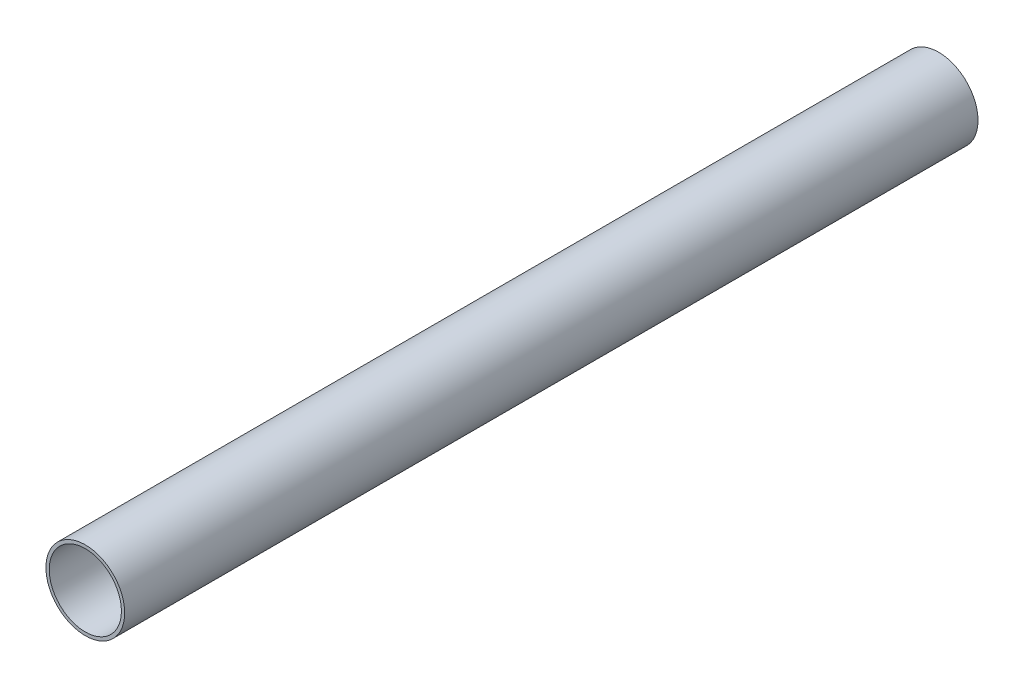
ISO-10303-21;
HEADER;
FILE_DESCRIPTION(('STEP AP214'),'2;1');
FILE_NAME('part.step','',(''),(''),'','','');
FILE_SCHEMA(('AUTOMOTIVE_DESIGN { 1 0 10303 214 1 1 1 1 }'));
ENDSEC;
DATA;
#1=APPLICATION_CONTEXT('core data for automotive mechanical design processes');
#2=APPLICATION_PROTOCOL_DEFINITION('international standard','automotive_design',2000,#1);
#3=PRODUCT_CONTEXT('',#1,'mechanical');
#4=PRODUCT('Part','Part','',(#3));
#5=PRODUCT_RELATED_PRODUCT_CATEGORY('part','',(#4));
#6=PRODUCT_DEFINITION_FORMATION('','',#4);
#7=PRODUCT_DEFINITION_CONTEXT('part definition',#1,'design');
#8=PRODUCT_DEFINITION('design','',#6,#7);
#9=PRODUCT_DEFINITION_SHAPE('','',#8);
#10=(LENGTH_UNIT() NAMED_UNIT(*) SI_UNIT(.MILLI.,.METRE.));
#11=(NAMED_UNIT(*) PLANE_ANGLE_UNIT() SI_UNIT($,.RADIAN.));
#12=(NAMED_UNIT(*) SI_UNIT($,.STERADIAN.) SOLID_ANGLE_UNIT());
#13=UNCERTAINTY_MEASURE_WITH_UNIT(LENGTH_MEASURE(1.E-05),#10,'distance_accuracy_value','');
#14=(GEOMETRIC_REPRESENTATION_CONTEXT(3) GLOBAL_UNCERTAINTY_ASSIGNED_CONTEXT((#13)) GLOBAL_UNIT_ASSIGNED_CONTEXT((#10,
#11,#12)) REPRESENTATION_CONTEXT('',''));
#15=CARTESIAN_POINT('',(0.,0.,0.));
#16=DIRECTION('',(0.,0.,1.));
#17=DIRECTION('',(1.,0.,0.));
#18=AXIS2_PLACEMENT_3D('',#15,#16,#17);
#19=CARTESIAN_POINT('',(0.,0.,260.));
#20=DIRECTION('',(0.,0.,1.));
#21=DIRECTION('',(1.,0.,0.));
#22=AXIS2_PLACEMENT_3D('',#19,#20,#21);
#23=PLANE('',#22);
#24=CARTESIAN_POINT('',(0.,0.,260.));
#25=DIRECTION('',(0.,0.,1.));
#26=DIRECTION('',(1.,0.,0.));
#27=AXIS2_PLACEMENT_3D('',#24,#25,#26);
#28=CIRCLE('',#27,12.);
#29=CARTESIAN_POINT('',(12.,0.,260.));
#30=VERTEX_POINT('',#29);
#31=EDGE_CURVE('E10',#30,#30,#28,.T.);
#32=ORIENTED_EDGE('',*,*,#31,.T.);
#33=EDGE_LOOP('',(#32));
#34=FACE_BOUND('',#33,.T.);
#35=CARTESIAN_POINT('',(0.,0.,260.));
#36=DIRECTION('',(0.,0.,1.));
#37=DIRECTION('',(1.,0.,0.));
#38=AXIS2_PLACEMENT_3D('',#35,#36,#37);
#39=CIRCLE('',#38,11.);
#40=CARTESIAN_POINT('',(11.,0.,260.));
#41=VERTEX_POINT('',#40);
#42=EDGE_CURVE('E45',#41,#41,#39,.T.);
#43=ORIENTED_EDGE('',*,*,#42,.F.);
#44=EDGE_LOOP('',(#43));
#45=FACE_BOUND('',#44,.T.);
#46=ADVANCED_FACE('F34',(#34,#45),#23,.T.);
#47=CARTESIAN_POINT('',(0.,0.,0.));
#48=DIRECTION('',(0.,0.,1.));
#49=DIRECTION('',(1.,0.,0.));
#50=AXIS2_PLACEMENT_3D('',#47,#48,#49);
#51=PLANE('',#50);
#52=CARTESIAN_POINT('',(0.,0.,0.));
#53=DIRECTION('',(0.,0.,1.));
#54=DIRECTION('',(1.,0.,0.));
#55=AXIS2_PLACEMENT_3D('',#52,#53,#54);
#56=CIRCLE('',#55,12.);
#57=CARTESIAN_POINT('',(12.,0.,0.));
#58=VERTEX_POINT('',#57);
#59=EDGE_CURVE('E38',#58,#58,#56,.T.);
#60=ORIENTED_EDGE('',*,*,#59,.F.);
#61=EDGE_LOOP('',(#60));
#62=FACE_BOUND('',#61,.T.);
#63=CARTESIAN_POINT('',(0.,0.,0.));
#64=DIRECTION('',(0.,0.,1.));
#65=DIRECTION('',(1.,0.,0.));
#66=AXIS2_PLACEMENT_3D('',#63,#64,#65);
#67=CIRCLE('',#66,11.);
#68=CARTESIAN_POINT('',(11.,0.,0.));
#69=VERTEX_POINT('',#68);
#70=EDGE_CURVE('E47',#69,#69,#67,.T.);
#71=ORIENTED_EDGE('',*,*,#70,.T.);
#72=EDGE_LOOP('',(#71));
#73=FACE_BOUND('',#72,.T.);
#74=ADVANCED_FACE('F57',(#62,#73),#51,.F.);
#75=CARTESIAN_POINT('',(0.,0.,260.));
#76=DIRECTION('',(0.,0.,-1.));
#77=DIRECTION('',(-1.,0.,0.));
#78=AXIS2_PLACEMENT_3D('',#75,#76,#77);
#79=CYLINDRICAL_SURFACE('',#78,12.);
#80=ORIENTED_EDGE('',*,*,#31,.F.);
#81=EDGE_LOOP('',(#80));
#82=FACE_BOUND('',#81,.T.);
#83=ORIENTED_EDGE('',*,*,#59,.T.);
#84=EDGE_LOOP('',(#83));
#85=FACE_BOUND('',#84,.T.);
#86=ADVANCED_FACE('F36',(#82,#85),#79,.T.);
#87=CARTESIAN_POINT('',(0.,0.,260.));
#88=DIRECTION('',(0.,0.,-1.));
#89=DIRECTION('',(-1.,0.,0.));
#90=AXIS2_PLACEMENT_3D('',#87,#88,#89);
#91=CYLINDRICAL_SURFACE('',#90,11.);
#92=ORIENTED_EDGE('',*,*,#42,.T.);
#93=EDGE_LOOP('',(#92));
#94=FACE_BOUND('',#93,.T.);
#95=ORIENTED_EDGE('',*,*,#70,.F.);
#96=EDGE_LOOP('',(#95));
#97=FACE_BOUND('',#96,.T.);
#98=ADVANCED_FACE('F53',(#94,#97),#91,.F.);
#99=CLOSED_SHELL('',(#46,#74,#86,#98));
#100=MANIFOLD_SOLID_BREP('B2',#99);
#101=ADVANCED_BREP_SHAPE_REPRESENTATION('',(#18,#100),#14);
#102=SHAPE_DEFINITION_REPRESENTATION(#9,#101);
ENDSEC;
END-ISO-10303-21;
